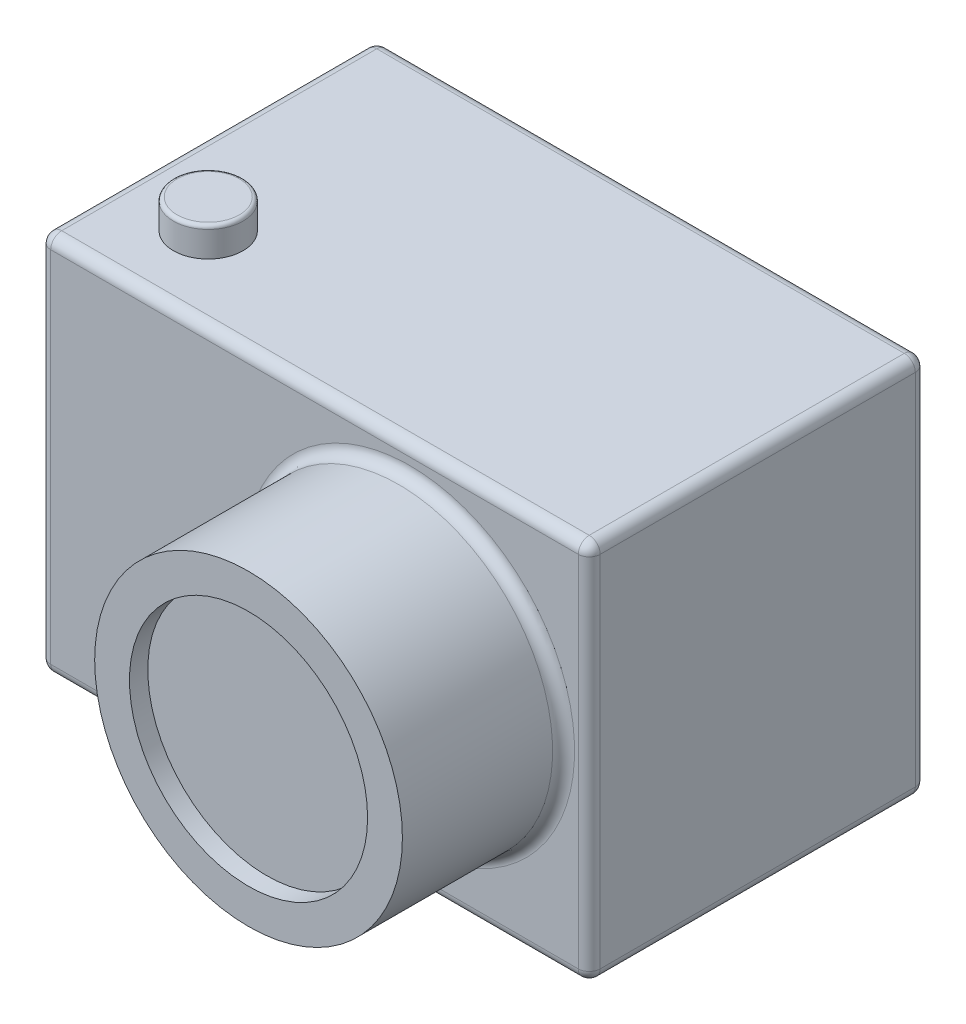
ISO-10303-21;
HEADER;
FILE_DESCRIPTION(('STEP AP214'),'2;1');
FILE_NAME('part.step','',(''),(''),'','','');
FILE_SCHEMA(('AUTOMOTIVE_DESIGN { 1 0 10303 214 1 1 1 1 }'));
ENDSEC;
DATA;
#1=APPLICATION_CONTEXT('core data for automotive mechanical design processes');
#2=APPLICATION_PROTOCOL_DEFINITION('international standard','automotive_design',2000,#1);
#3=PRODUCT_CONTEXT('',#1,'mechanical');
#4=PRODUCT('Part','Part','',(#3));
#5=PRODUCT_RELATED_PRODUCT_CATEGORY('part','',(#4));
#6=PRODUCT_DEFINITION_FORMATION('','',#4);
#7=PRODUCT_DEFINITION_CONTEXT('part definition',#1,'design');
#8=PRODUCT_DEFINITION('design','',#6,#7);
#9=PRODUCT_DEFINITION_SHAPE('','',#8);
#10=(LENGTH_UNIT() NAMED_UNIT(*) SI_UNIT(.MILLI.,.METRE.));
#11=(NAMED_UNIT(*) PLANE_ANGLE_UNIT() SI_UNIT($,.RADIAN.));
#12=(NAMED_UNIT(*) SI_UNIT($,.STERADIAN.) SOLID_ANGLE_UNIT());
#13=UNCERTAINTY_MEASURE_WITH_UNIT(LENGTH_MEASURE(1.E-05),#10,'distance_accuracy_value','');
#14=(GEOMETRIC_REPRESENTATION_CONTEXT(3) GLOBAL_UNCERTAINTY_ASSIGNED_CONTEXT((#13)) GLOBAL_UNIT_ASSIGNED_CONTEXT((#10,
#11,#12)) REPRESENTATION_CONTEXT('',''));
#15=CARTESIAN_POINT('',(0.,0.,0.));
#16=DIRECTION('',(0.,0.,1.));
#17=DIRECTION('',(1.,0.,0.));
#18=AXIS2_PLACEMENT_3D('',#15,#16,#17);
#19=CARTESIAN_POINT('',(0.,0.,-92.));
#20=DIRECTION('',(-1.,0.,0.));
#21=DIRECTION('',(0.,0.,1.));
#22=AXIS2_PLACEMENT_3D('',#19,#20,#21);
#23=PLANE('',#22);
#24=DIRECTION('',(0.,0.,1.));
#25=VECTOR('',#24,1.);
#26=CARTESIAN_POINT('',(0.,101.,-92.));
#27=LINE('',#26,#25);
#28=CARTESIAN_POINT('',(0.,101.,-3.));
#29=VERTEX_POINT('',#28);
#30=CARTESIAN_POINT('',(0.,101.,-89.));
#31=VERTEX_POINT('',#30);
#32=EDGE_CURVE('E303',#29,#31,#27,.F.);
#33=ORIENTED_EDGE('',*,*,#32,.T.);
#34=DIRECTION('',(0.,-1.,0.));
#35=VECTOR('',#34,1.);
#36=CARTESIAN_POINT('',(0.,0.,-89.));
#37=LINE('',#36,#35);
#38=CARTESIAN_POINT('',(0.,3.,-89.));
#39=VERTEX_POINT('',#38);
#40=EDGE_CURVE('E155',#31,#39,#37,.T.);
#41=ORIENTED_EDGE('',*,*,#40,.T.);
#42=DIRECTION('',(0.,0.,1.));
#43=VECTOR('',#42,1.);
#44=CARTESIAN_POINT('',(0.,3.,-92.));
#45=LINE('',#44,#43);
#46=CARTESIAN_POINT('',(0.,3.,-3.));
#47=VERTEX_POINT('',#46);
#48=EDGE_CURVE('E301',#39,#47,#45,.T.);
#49=ORIENTED_EDGE('',*,*,#48,.T.);
#50=DIRECTION('',(0.,-1.,0.));
#51=VECTOR('',#50,1.);
#52=CARTESIAN_POINT('',(0.,104.,-3.));
#53=LINE('',#52,#51);
#54=EDGE_CURVE('E299',#47,#29,#53,.F.);
#55=ORIENTED_EDGE('',*,*,#54,.T.);
#56=EDGE_LOOP('',(#33,#41,#49,#55));
#57=FACE_BOUND('',#56,.T.);
#58=ADVANCED_FACE('F132',(#57),#23,.T.);
#59=CARTESIAN_POINT('',(0.,104.,-92.));
#60=DIRECTION('',(0.,1.,0.));
#61=DIRECTION('',(0.,0.,1.));
#62=AXIS2_PLACEMENT_3D('',#59,#60,#61);
#63=PLANE('',#62);
#64=CARTESIAN_POINT('',(23.,104.,-23.));
#65=DIRECTION('',(0.,1.,0.));
#66=DIRECTION('',(0.,0.,1.));
#67=AXIS2_PLACEMENT_3D('',#64,#65,#66);
#68=CIRCLE('',#67,9.5);
#69=CARTESIAN_POINT('',(23.,104.,-13.5));
#70=VERTEX_POINT('',#69);
#71=EDGE_CURVE('E235',#70,#70,#68,.T.);
#72=ORIENTED_EDGE('',*,*,#71,.F.);
#73=EDGE_LOOP('',(#72));
#74=FACE_BOUND('',#73,.T.);
#75=DIRECTION('',(-1.,0.,0.));
#76=VECTOR('',#75,1.);
#77=CARTESIAN_POINT('',(0.,104.,-89.));
#78=LINE('',#77,#76);
#79=CARTESIAN_POINT('',(147.,104.,-89.));
#80=VERTEX_POINT('',#79);
#81=CARTESIAN_POINT('',(3.,104.,-89.));
#82=VERTEX_POINT('',#81);
#83=EDGE_CURVE('E294',#80,#82,#78,.T.);
#84=ORIENTED_EDGE('',*,*,#83,.T.);
#85=DIRECTION('',(0.,0.,1.));
#86=VECTOR('',#85,1.);
#87=CARTESIAN_POINT('',(3.,104.,-92.));
#88=LINE('',#87,#86);
#89=CARTESIAN_POINT('',(3.,104.,-3.));
#90=VERTEX_POINT('',#89);
#91=EDGE_CURVE('E296',#82,#90,#88,.T.);
#92=ORIENTED_EDGE('',*,*,#91,.T.);
#93=DIRECTION('',(-1.,0.,0.));
#94=VECTOR('',#93,1.);
#95=CARTESIAN_POINT('',(150.,104.,-3.));
#96=LINE('',#95,#94);
#97=CARTESIAN_POINT('',(147.,104.,-3.));
#98=VERTEX_POINT('',#97);
#99=EDGE_CURVE('E290',#90,#98,#96,.F.);
#100=ORIENTED_EDGE('',*,*,#99,.T.);
#101=DIRECTION('',(0.,0.,1.));
#102=VECTOR('',#101,1.);
#103=CARTESIAN_POINT('',(147.,104.,-92.));
#104=LINE('',#103,#102);
#105=EDGE_CURVE('E292',#98,#80,#104,.F.);
#106=ORIENTED_EDGE('',*,*,#105,.T.);
#107=EDGE_LOOP('',(#84,#92,#100,#106));
#108=FACE_BOUND('',#107,.T.);
#109=ADVANCED_FACE('F384',(#74,#108),#63,.T.);
#110=CARTESIAN_POINT('',(150.,0.,-92.));
#111=DIRECTION('',(1.,0.,0.));
#112=DIRECTION('',(0.,0.,-1.));
#113=AXIS2_PLACEMENT_3D('',#110,#111,#112);
#114=PLANE('',#113);
#115=DIRECTION('',(0.,0.,1.));
#116=VECTOR('',#115,1.);
#117=CARTESIAN_POINT('',(150.,3.,-92.));
#118=LINE('',#117,#116);
#119=CARTESIAN_POINT('',(150.,3.,-3.));
#120=VERTEX_POINT('',#119);
#121=CARTESIAN_POINT('',(150.,3.,-89.));
#122=VERTEX_POINT('',#121);
#123=EDGE_CURVE('E259',#120,#122,#118,.F.);
#124=ORIENTED_EDGE('',*,*,#123,.T.);
#125=DIRECTION('',(0.,1.,0.));
#126=VECTOR('',#125,1.);
#127=CARTESIAN_POINT('',(150.,0.,-89.));
#128=LINE('',#127,#126);
#129=CARTESIAN_POINT('',(150.,101.,-89.));
#130=VERTEX_POINT('',#129);
#131=EDGE_CURVE('E229',#122,#130,#128,.T.);
#132=ORIENTED_EDGE('',*,*,#131,.T.);
#133=DIRECTION('',(0.,0.,1.));
#134=VECTOR('',#133,1.);
#135=CARTESIAN_POINT('',(150.,101.,-92.));
#136=LINE('',#135,#134);
#137=CARTESIAN_POINT('',(150.,101.,-3.));
#138=VERTEX_POINT('',#137);
#139=EDGE_CURVE('E248',#130,#138,#136,.T.);
#140=ORIENTED_EDGE('',*,*,#139,.T.);
#141=DIRECTION('',(0.,1.,0.));
#142=VECTOR('',#141,1.);
#143=CARTESIAN_POINT('',(150.,0.,-3.));
#144=LINE('',#143,#142);
#145=EDGE_CURVE('E254',#138,#120,#144,.F.);
#146=ORIENTED_EDGE('',*,*,#145,.T.);
#147=EDGE_LOOP('',(#124,#132,#140,#146));
#148=FACE_BOUND('',#147,.T.);
#149=ADVANCED_FACE('F257',(#148),#114,.T.);
#150=CARTESIAN_POINT('',(0.,0.,-92.));
#151=DIRECTION('',(0.,-1.,0.));
#152=DIRECTION('',(0.,0.,-1.));
#153=AXIS2_PLACEMENT_3D('',#150,#151,#152);
#154=PLANE('',#153);
#155=DIRECTION('',(0.,0.,1.));
#156=VECTOR('',#155,1.);
#157=CARTESIAN_POINT('',(3.,0.,-92.));
#158=LINE('',#157,#156);
#159=CARTESIAN_POINT('',(3.,0.,-3.));
#160=VERTEX_POINT('',#159);
#161=CARTESIAN_POINT('',(3.,0.,-89.));
#162=VERTEX_POINT('',#161);
#163=EDGE_CURVE('E274',#160,#162,#158,.F.);
#164=ORIENTED_EDGE('',*,*,#163,.T.);
#165=DIRECTION('',(1.,0.,0.));
#166=VECTOR('',#165,1.);
#167=CARTESIAN_POINT('',(0.,0.,-89.));
#168=LINE('',#167,#166);
#169=CARTESIAN_POINT('',(147.,0.,-89.));
#170=VERTEX_POINT('',#169);
#171=EDGE_CURVE('E279',#162,#170,#168,.T.);
#172=ORIENTED_EDGE('',*,*,#171,.T.);
#173=DIRECTION('',(0.,0.,1.));
#174=VECTOR('',#173,1.);
#175=CARTESIAN_POINT('',(147.,0.,-92.));
#176=LINE('',#175,#174);
#177=CARTESIAN_POINT('',(147.,0.,-3.));
#178=VERTEX_POINT('',#177);
#179=EDGE_CURVE('E276',#170,#178,#176,.T.);
#180=ORIENTED_EDGE('',*,*,#179,.T.);
#181=DIRECTION('',(1.,0.,0.));
#182=VECTOR('',#181,1.);
#183=CARTESIAN_POINT('',(0.,0.,-3.));
#184=LINE('',#183,#182);
#185=EDGE_CURVE('E272',#178,#160,#184,.F.);
#186=ORIENTED_EDGE('',*,*,#185,.T.);
#187=EDGE_LOOP('',(#164,#172,#180,#186));
#188=FACE_BOUND('',#187,.T.);
#189=ADVANCED_FACE('F393',(#188),#154,.T.);
#190=CARTESIAN_POINT('',(0.,0.,-92.));
#191=DIRECTION('',(0.,0.,-1.));
#192=DIRECTION('',(-1.,0.,0.));
#193=AXIS2_PLACEMENT_3D('',#190,#191,#192);
#194=PLANE('',#193);
#195=DIRECTION('',(-1.,0.,0.));
#196=VECTOR('',#195,1.);
#197=CARTESIAN_POINT('',(0.,101.,-92.));
#198=LINE('',#197,#196);
#199=CARTESIAN_POINT('',(3.,101.,-92.));
#200=VERTEX_POINT('',#199);
#201=CARTESIAN_POINT('',(147.,101.,-92.));
#202=VERTEX_POINT('',#201);
#203=EDGE_CURVE('E269',#200,#202,#198,.F.);
#204=ORIENTED_EDGE('',*,*,#203,.T.);
#205=DIRECTION('',(0.,1.,0.));
#206=VECTOR('',#205,1.);
#207=CARTESIAN_POINT('',(147.,0.,-92.));
#208=LINE('',#207,#206);
#209=CARTESIAN_POINT('',(147.,3.,-92.));
#210=VERTEX_POINT('',#209);
#211=EDGE_CURVE('E231',#202,#210,#208,.F.);
#212=ORIENTED_EDGE('',*,*,#211,.T.);
#213=DIRECTION('',(1.,0.,0.));
#214=VECTOR('',#213,1.);
#215=CARTESIAN_POINT('',(0.,3.,-92.));
#216=LINE('',#215,#214);
#217=CARTESIAN_POINT('',(3.,3.,-92.));
#218=VERTEX_POINT('',#217);
#219=EDGE_CURVE('E263',#210,#218,#216,.F.);
#220=ORIENTED_EDGE('',*,*,#219,.T.);
#221=DIRECTION('',(0.,-1.,0.));
#222=VECTOR('',#221,1.);
#223=CARTESIAN_POINT('',(3.,0.,-92.));
#224=LINE('',#223,#222);
#225=EDGE_CURVE('E261',#218,#200,#224,.F.);
#226=ORIENTED_EDGE('',*,*,#225,.T.);
#227=EDGE_LOOP('',(#204,#212,#220,#226));
#228=FACE_BOUND('',#227,.T.);
#229=ADVANCED_FACE('F505',(#228),#194,.T.);
#230=CARTESIAN_POINT('',(0.,0.,0.));
#231=DIRECTION('',(0.,0.,-1.));
#232=DIRECTION('',(-1.,0.,0.));
#233=AXIS2_PLACEMENT_3D('',#230,#231,#232);
#234=PLANE('',#233);
#235=CARTESIAN_POINT('',(101.,54.,0.));
#236=DIRECTION('',(0.,0.,-1.));
#237=DIRECTION('',(-1.,0.,0.));
#238=AXIS2_PLACEMENT_3D('',#235,#236,#237);
#239=CIRCLE('',#238,45.);
#240=CARTESIAN_POINT('',(56.,54.,0.));
#241=VERTEX_POINT('',#240);
#242=EDGE_CURVE('E363',#241,#241,#239,.T.);
#243=ORIENTED_EDGE('',*,*,#242,.T.);
#244=EDGE_LOOP('',(#243));
#245=FACE_BOUND('',#244,.T.);
#246=DIRECTION('',(1.,0.,0.));
#247=VECTOR('',#246,1.);
#248=CARTESIAN_POINT('',(150.,3.,0.));
#249=LINE('',#248,#247);
#250=CARTESIAN_POINT('',(3.,3.,0.));
#251=VERTEX_POINT('',#250);
#252=CARTESIAN_POINT('',(147.,3.,0.));
#253=VERTEX_POINT('',#252);
#254=EDGE_CURVE('E283',#251,#253,#249,.T.);
#255=ORIENTED_EDGE('',*,*,#254,.T.);
#256=DIRECTION('',(0.,1.,0.));
#257=VECTOR('',#256,1.);
#258=CARTESIAN_POINT('',(147.,104.,0.));
#259=LINE('',#258,#257);
#260=CARTESIAN_POINT('',(147.,101.,0.));
#261=VERTEX_POINT('',#260);
#262=EDGE_CURVE('E287',#253,#261,#259,.T.);
#263=ORIENTED_EDGE('',*,*,#262,.T.);
#264=DIRECTION('',(-1.,0.,0.));
#265=VECTOR('',#264,1.);
#266=CARTESIAN_POINT('',(0.,101.,0.));
#267=LINE('',#266,#265);
#268=CARTESIAN_POINT('',(3.,101.,0.));
#269=VERTEX_POINT('',#268);
#270=EDGE_CURVE('E285',#261,#269,#267,.T.);
#271=ORIENTED_EDGE('',*,*,#270,.T.);
#272=DIRECTION('',(0.,-1.,0.));
#273=VECTOR('',#272,1.);
#274=CARTESIAN_POINT('',(3.,0.,0.));
#275=LINE('',#274,#273);
#276=EDGE_CURVE('E281',#269,#251,#275,.T.);
#277=ORIENTED_EDGE('',*,*,#276,.T.);
#278=EDGE_LOOP('',(#255,#263,#271,#277));
#279=FACE_BOUND('',#278,.T.);
#280=ADVANCED_FACE('F483',(#245,#279),#234,.F.);
#281=CARTESIAN_POINT('',(101.,54.,44.));
#282=DIRECTION('',(0.,0.,-1.));
#283=DIRECTION('',(-1.,0.,0.));
#284=AXIS2_PLACEMENT_3D('',#281,#282,#283);
#285=CYLINDRICAL_SURFACE('',#284,42.);
#286=CARTESIAN_POINT('',(101.,54.,3.));
#287=DIRECTION('',(0.,0.,-1.));
#288=DIRECTION('',(-1.,0.,0.));
#289=AXIS2_PLACEMENT_3D('',#286,#287,#288);
#290=CIRCLE('',#289,42.);
#291=CARTESIAN_POINT('',(59.,54.,3.));
#292=VERTEX_POINT('',#291);
#293=EDGE_CURVE('E305',#292,#292,#290,.F.);
#294=ORIENTED_EDGE('',*,*,#293,.T.);
#295=EDGE_LOOP('',(#294));
#296=FACE_BOUND('',#295,.T.);
#297=CARTESIAN_POINT('',(101.,54.,44.));
#298=DIRECTION('',(0.,0.,1.));
#299=DIRECTION('',(1.,0.,0.));
#300=AXIS2_PLACEMENT_3D('',#297,#298,#299);
#301=CIRCLE('',#300,42.);
#302=CARTESIAN_POINT('',(143.,54.,44.));
#303=VERTEX_POINT('',#302);
#304=EDGE_CURVE('E255',#303,#303,#301,.T.);
#305=ORIENTED_EDGE('',*,*,#304,.F.);
#306=EDGE_LOOP('',(#305));
#307=FACE_BOUND('',#306,.T.);
#308=ADVANCED_FACE('F480',(#296,#307),#285,.T.);
#309=CARTESIAN_POINT('',(101.,54.,44.));
#310=DIRECTION('',(0.,0.,1.));
#311=DIRECTION('',(1.,0.,0.));
#312=AXIS2_PLACEMENT_3D('',#309,#310,#311);
#313=PLANE('',#312);
#314=CARTESIAN_POINT('',(101.,54.,44.));
#315=DIRECTION('',(0.,0.,1.));
#316=DIRECTION('',(1.,0.,0.));
#317=AXIS2_PLACEMENT_3D('',#314,#315,#316);
#318=CIRCLE('',#317,32.5);
#319=CARTESIAN_POINT('',(133.5,54.,44.));
#320=VERTEX_POINT('',#319);
#321=EDGE_CURVE('E549',#320,#320,#318,.T.);
#322=ORIENTED_EDGE('',*,*,#321,.F.);
#323=EDGE_LOOP('',(#322));
#324=FACE_BOUND('',#323,.T.);
#325=ORIENTED_EDGE('',*,*,#304,.T.);
#326=EDGE_LOOP('',(#325));
#327=FACE_BOUND('',#326,.T.);
#328=ADVANCED_FACE('F467',(#324,#327),#313,.T.);
#329=CARTESIAN_POINT('',(3.,0.,-3.));
#330=DIRECTION('',(0.,1.,0.));
#331=DIRECTION('',(0.,0.,1.));
#332=AXIS2_PLACEMENT_3D('',#329,#330,#331);
#333=CYLINDRICAL_SURFACE('',#332,3.);
#334=CARTESIAN_POINT('',(3.,3.,-3.));
#335=DIRECTION('',(0.,-1.,0.));
#336=DIRECTION('',(0.,0.,-1.));
#337=AXIS2_PLACEMENT_3D('',#334,#335,#336);
#338=CIRCLE('',#337,3.);
#339=EDGE_CURVE('E358',#251,#47,#338,.T.);
#340=ORIENTED_EDGE('',*,*,#339,.F.);
#341=ORIENTED_EDGE('',*,*,#276,.F.);
#342=CARTESIAN_POINT('',(3.,101.,-3.));
#343=DIRECTION('',(0.,1.,0.));
#344=DIRECTION('',(0.,0.,1.));
#345=AXIS2_PLACEMENT_3D('',#342,#343,#344);
#346=CIRCLE('',#345,3.);
#347=EDGE_CURVE('E355',#29,#269,#346,.T.);
#348=ORIENTED_EDGE('',*,*,#347,.F.);
#349=ORIENTED_EDGE('',*,*,#54,.F.);
#350=EDGE_LOOP('',(#340,#341,#348,#349));
#351=FACE_BOUND('',#350,.T.);
#352=ADVANCED_FACE('F464',(#351),#333,.T.);
#353=CARTESIAN_POINT('',(3.,3.,-3.));
#354=DIRECTION('',(-1.,0.,0.));
#355=DIRECTION('',(0.,0.,1.));
#356=AXIS2_PLACEMENT_3D('',#353,#354,#355);
#357=SPHERICAL_SURFACE('',#356,3.);
#358=CARTESIAN_POINT('',(3.,3.,-3.));
#359=DIRECTION('',(-1.,0.,0.));
#360=DIRECTION('',(0.,0.,1.));
#361=AXIS2_PLACEMENT_3D('',#358,#359,#360);
#362=CIRCLE('',#361,3.);
#363=EDGE_CURVE('E349',#251,#160,#362,.F.);
#364=ORIENTED_EDGE('',*,*,#363,.F.);
#365=ORIENTED_EDGE('',*,*,#339,.T.);
#366=CARTESIAN_POINT('',(3.,3.,-3.));
#367=DIRECTION('',(0.,0.,1.));
#368=DIRECTION('',(1.,0.,0.));
#369=AXIS2_PLACEMENT_3D('',#366,#367,#368);
#370=CIRCLE('',#369,3.);
#371=EDGE_CURVE('E352',#160,#47,#370,.F.);
#372=ORIENTED_EDGE('',*,*,#371,.F.);
#373=EDGE_LOOP('',(#364,#365,#372));
#374=FACE_BOUND('',#373,.T.);
#375=ADVANCED_FACE('F460',(#374),#357,.T.);
#376=CARTESIAN_POINT('',(3.,101.,-3.));
#377=DIRECTION('',(0.,0.,1.));
#378=DIRECTION('',(1.,0.,0.));
#379=AXIS2_PLACEMENT_3D('',#376,#377,#378);
#380=SPHERICAL_SURFACE('',#379,3.);
#381=CARTESIAN_POINT('',(3.,101.,-3.));
#382=DIRECTION('',(0.,0.,1.));
#383=DIRECTION('',(1.,0.,0.));
#384=AXIS2_PLACEMENT_3D('',#381,#382,#383);
#385=CIRCLE('',#384,3.);
#386=EDGE_CURVE('E343',#29,#90,#385,.F.);
#387=ORIENTED_EDGE('',*,*,#386,.F.);
#388=ORIENTED_EDGE('',*,*,#347,.T.);
#389=CARTESIAN_POINT('',(3.,101.,-3.));
#390=DIRECTION('',(-1.,0.,0.));
#391=DIRECTION('',(0.,0.,1.));
#392=AXIS2_PLACEMENT_3D('',#389,#390,#391);
#393=CIRCLE('',#392,3.);
#394=EDGE_CURVE('E346',#90,#269,#393,.F.);
#395=ORIENTED_EDGE('',*,*,#394,.F.);
#396=EDGE_LOOP('',(#387,#388,#395));
#397=FACE_BOUND('',#396,.T.);
#398=ADVANCED_FACE('F456',(#397),#380,.T.);
#399=CARTESIAN_POINT('',(3.,3.,-92.));
#400=DIRECTION('',(0.,0.,1.));
#401=DIRECTION('',(1.,0.,0.));
#402=AXIS2_PLACEMENT_3D('',#399,#400,#401);
#403=CYLINDRICAL_SURFACE('',#402,3.);
#404=ORIENTED_EDGE('',*,*,#371,.T.);
#405=ORIENTED_EDGE('',*,*,#48,.F.);
#406=CARTESIAN_POINT('',(3.,3.,-89.));
#407=DIRECTION('',(0.,0.,-1.));
#408=DIRECTION('',(-1.,0.,0.));
#409=AXIS2_PLACEMENT_3D('',#406,#407,#408);
#410=CIRCLE('',#409,3.);
#411=EDGE_CURVE('E337',#162,#39,#410,.T.);
#412=ORIENTED_EDGE('',*,*,#411,.F.);
#413=ORIENTED_EDGE('',*,*,#163,.F.);
#414=EDGE_LOOP('',(#404,#405,#412,#413));
#415=FACE_BOUND('',#414,.T.);
#416=ADVANCED_FACE('F452',(#415),#403,.T.);
#417=CARTESIAN_POINT('',(0.,3.,-3.));
#418=DIRECTION('',(-1.,0.,0.));
#419=DIRECTION('',(0.,0.,1.));
#420=AXIS2_PLACEMENT_3D('',#417,#418,#419);
#421=CYLINDRICAL_SURFACE('',#420,3.);
#422=ORIENTED_EDGE('',*,*,#363,.T.);
#423=ORIENTED_EDGE('',*,*,#185,.F.);
#424=CARTESIAN_POINT('',(147.,3.,-3.));
#425=DIRECTION('',(1.,0.,0.));
#426=DIRECTION('',(0.,0.,-1.));
#427=AXIS2_PLACEMENT_3D('',#424,#425,#426);
#428=CIRCLE('',#427,3.);
#429=EDGE_CURVE('E334',#253,#178,#428,.T.);
#430=ORIENTED_EDGE('',*,*,#429,.F.);
#431=ORIENTED_EDGE('',*,*,#254,.F.);
#432=EDGE_LOOP('',(#422,#423,#430,#431));
#433=FACE_BOUND('',#432,.T.);
#434=ADVANCED_FACE('F448',(#433),#421,.T.);
#435=CARTESIAN_POINT('',(147.,0.,-3.));
#436=DIRECTION('',(0.,-1.,0.));
#437=DIRECTION('',(0.,0.,-1.));
#438=AXIS2_PLACEMENT_3D('',#435,#436,#437);
#439=CYLINDRICAL_SURFACE('',#438,3.);
#440=CARTESIAN_POINT('',(147.,101.,-3.));
#441=DIRECTION('',(0.,1.,0.));
#442=DIRECTION('',(0.,0.,1.));
#443=AXIS2_PLACEMENT_3D('',#440,#441,#442);
#444=CIRCLE('',#443,3.);
#445=EDGE_CURVE('E328',#261,#138,#444,.T.);
#446=ORIENTED_EDGE('',*,*,#445,.F.);
#447=ORIENTED_EDGE('',*,*,#262,.F.);
#448=CARTESIAN_POINT('',(147.,3.,-3.));
#449=DIRECTION('',(0.,-1.,0.));
#450=DIRECTION('',(0.,0.,-1.));
#451=AXIS2_PLACEMENT_3D('',#448,#449,#450);
#452=CIRCLE('',#451,3.);
#453=EDGE_CURVE('E331',#120,#253,#452,.T.);
#454=ORIENTED_EDGE('',*,*,#453,.F.);
#455=ORIENTED_EDGE('',*,*,#145,.F.);
#456=EDGE_LOOP('',(#446,#447,#454,#455));
#457=FACE_BOUND('',#456,.T.);
#458=ADVANCED_FACE('F444',(#457),#439,.T.);
#459=CARTESIAN_POINT('',(0.,101.,-3.));
#460=DIRECTION('',(1.,0.,0.));
#461=DIRECTION('',(0.,0.,-1.));
#462=AXIS2_PLACEMENT_3D('',#459,#460,#461);
#463=CYLINDRICAL_SURFACE('',#462,3.);
#464=ORIENTED_EDGE('',*,*,#394,.T.);
#465=ORIENTED_EDGE('',*,*,#270,.F.);
#466=CARTESIAN_POINT('',(147.,101.,-3.));
#467=DIRECTION('',(1.,0.,0.));
#468=DIRECTION('',(0.,0.,-1.));
#469=AXIS2_PLACEMENT_3D('',#466,#467,#468);
#470=CIRCLE('',#469,3.);
#471=EDGE_CURVE('E326',#98,#261,#470,.T.);
#472=ORIENTED_EDGE('',*,*,#471,.F.);
#473=ORIENTED_EDGE('',*,*,#99,.F.);
#474=EDGE_LOOP('',(#464,#465,#472,#473));
#475=FACE_BOUND('',#474,.T.);
#476=ADVANCED_FACE('F440',(#475),#463,.T.);
#477=CARTESIAN_POINT('',(3.,101.,-92.));
#478=DIRECTION('',(0.,0.,1.));
#479=DIRECTION('',(1.,0.,0.));
#480=AXIS2_PLACEMENT_3D('',#477,#478,#479);
#481=CYLINDRICAL_SURFACE('',#480,3.);
#482=ORIENTED_EDGE('',*,*,#386,.T.);
#483=ORIENTED_EDGE('',*,*,#91,.F.);
#484=CARTESIAN_POINT('',(3.,101.,-89.));
#485=DIRECTION('',(0.,0.,-1.));
#486=DIRECTION('',(-1.,0.,0.));
#487=AXIS2_PLACEMENT_3D('',#484,#485,#486);
#488=CIRCLE('',#487,3.);
#489=EDGE_CURVE('E324',#31,#82,#488,.T.);
#490=ORIENTED_EDGE('',*,*,#489,.F.);
#491=ORIENTED_EDGE('',*,*,#32,.F.);
#492=EDGE_LOOP('',(#482,#483,#490,#491));
#493=FACE_BOUND('',#492,.T.);
#494=ADVANCED_FACE('F436',(#493),#481,.T.);
#495=CARTESIAN_POINT('',(3.,0.,-89.));
#496=DIRECTION('',(0.,-1.,0.));
#497=DIRECTION('',(0.,0.,-1.));
#498=AXIS2_PLACEMENT_3D('',#495,#496,#497);
#499=CYLINDRICAL_SURFACE('',#498,3.);
#500=CARTESIAN_POINT('',(3.,3.,-89.));
#501=DIRECTION('',(0.,-1.,0.));
#502=DIRECTION('',(0.,0.,-1.));
#503=AXIS2_PLACEMENT_3D('',#500,#501,#502);
#504=CIRCLE('',#503,3.);
#505=EDGE_CURVE('E340',#39,#218,#504,.T.);
#506=ORIENTED_EDGE('',*,*,#505,.F.);
#507=ORIENTED_EDGE('',*,*,#40,.F.);
#508=CARTESIAN_POINT('',(3.,101.,-89.));
#509=DIRECTION('',(0.,1.,0.));
#510=DIRECTION('',(0.,0.,1.));
#511=AXIS2_PLACEMENT_3D('',#508,#509,#510);
#512=CIRCLE('',#511,3.);
#513=EDGE_CURVE('E147',#200,#31,#512,.T.);
#514=ORIENTED_EDGE('',*,*,#513,.F.);
#515=ORIENTED_EDGE('',*,*,#225,.F.);
#516=EDGE_LOOP('',(#506,#507,#514,#515));
#517=FACE_BOUND('',#516,.T.);
#518=ADVANCED_FACE('F432',(#517),#499,.T.);
#519=CARTESIAN_POINT('',(3.,3.,-89.));
#520=DIRECTION('',(-1.,0.,0.));
#521=DIRECTION('',(0.,0.,1.));
#522=AXIS2_PLACEMENT_3D('',#519,#520,#521);
#523=SPHERICAL_SURFACE('',#522,3.);
#524=ORIENTED_EDGE('',*,*,#411,.T.);
#525=ORIENTED_EDGE('',*,*,#505,.T.);
#526=CARTESIAN_POINT('',(3.,3.,-89.));
#527=DIRECTION('',(-1.,0.,0.));
#528=DIRECTION('',(0.,0.,1.));
#529=AXIS2_PLACEMENT_3D('',#526,#527,#528);
#530=CIRCLE('',#529,3.);
#531=EDGE_CURVE('E320',#162,#218,#530,.F.);
#532=ORIENTED_EDGE('',*,*,#531,.F.);
#533=EDGE_LOOP('',(#524,#525,#532));
#534=FACE_BOUND('',#533,.T.);
#535=ADVANCED_FACE('F428',(#534),#523,.T.);
#536=CARTESIAN_POINT('',(147.,3.,-3.));
#537=DIRECTION('',(0.,0.,1.));
#538=DIRECTION('',(1.,0.,0.));
#539=AXIS2_PLACEMENT_3D('',#536,#537,#538);
#540=SPHERICAL_SURFACE('',#539,3.);
#541=ORIENTED_EDGE('',*,*,#453,.T.);
#542=ORIENTED_EDGE('',*,*,#429,.T.);
#543=CARTESIAN_POINT('',(147.,3.,-3.));
#544=DIRECTION('',(0.,0.,1.));
#545=DIRECTION('',(1.,0.,0.));
#546=AXIS2_PLACEMENT_3D('',#543,#544,#545);
#547=CIRCLE('',#546,3.);
#548=EDGE_CURVE('E318',#120,#178,#547,.F.);
#549=ORIENTED_EDGE('',*,*,#548,.F.);
#550=EDGE_LOOP('',(#541,#542,#549));
#551=FACE_BOUND('',#550,.T.);
#552=ADVANCED_FACE('F424',(#551),#540,.T.);
#553=CARTESIAN_POINT('',(147.,101.,-3.));
#554=DIRECTION('',(0.,0.,1.));
#555=DIRECTION('',(1.,0.,0.));
#556=AXIS2_PLACEMENT_3D('',#553,#554,#555);
#557=SPHERICAL_SURFACE('',#556,3.);
#558=ORIENTED_EDGE('',*,*,#471,.T.);
#559=ORIENTED_EDGE('',*,*,#445,.T.);
#560=CARTESIAN_POINT('',(147.,101.,-3.));
#561=DIRECTION('',(0.,0.,1.));
#562=DIRECTION('',(1.,0.,0.));
#563=AXIS2_PLACEMENT_3D('',#560,#561,#562);
#564=CIRCLE('',#563,3.);
#565=EDGE_CURVE('E251',#98,#138,#564,.F.);
#566=ORIENTED_EDGE('',*,*,#565,.F.);
#567=EDGE_LOOP('',(#558,#559,#566));
#568=FACE_BOUND('',#567,.T.);
#569=ADVANCED_FACE('F421',(#568),#557,.T.);
#570=CARTESIAN_POINT('',(3.,101.,-89.));
#571=DIRECTION('',(-1.,0.,0.));
#572=DIRECTION('',(0.,0.,1.));
#573=AXIS2_PLACEMENT_3D('',#570,#571,#572);
#574=SPHERICAL_SURFACE('',#573,3.);
#575=ORIENTED_EDGE('',*,*,#513,.T.);
#576=ORIENTED_EDGE('',*,*,#489,.T.);
#577=CARTESIAN_POINT('',(3.,101.,-89.));
#578=DIRECTION('',(-1.,0.,0.));
#579=DIRECTION('',(0.,0.,1.));
#580=AXIS2_PLACEMENT_3D('',#577,#578,#579);
#581=CIRCLE('',#580,3.);
#582=EDGE_CURVE('E314',#200,#82,#581,.F.);
#583=ORIENTED_EDGE('',*,*,#582,.F.);
#584=EDGE_LOOP('',(#575,#576,#583));
#585=FACE_BOUND('',#584,.T.);
#586=ADVANCED_FACE('F417',(#585),#574,.T.);
#587=CARTESIAN_POINT('',(0.,3.,-89.));
#588=DIRECTION('',(1.,0.,0.));
#589=DIRECTION('',(0.,0.,-1.));
#590=AXIS2_PLACEMENT_3D('',#587,#588,#589);
#591=CYLINDRICAL_SURFACE('',#590,3.);
#592=ORIENTED_EDGE('',*,*,#531,.T.);
#593=ORIENTED_EDGE('',*,*,#219,.F.);
#594=CARTESIAN_POINT('',(147.,3.,-89.));
#595=DIRECTION('',(1.,0.,0.));
#596=DIRECTION('',(0.,0.,-1.));
#597=AXIS2_PLACEMENT_3D('',#594,#595,#596);
#598=CIRCLE('',#597,3.);
#599=EDGE_CURVE('E311',#170,#210,#598,.T.);
#600=ORIENTED_EDGE('',*,*,#599,.F.);
#601=ORIENTED_EDGE('',*,*,#171,.F.);
#602=EDGE_LOOP('',(#592,#593,#600,#601));
#603=FACE_BOUND('',#602,.T.);
#604=ADVANCED_FACE('F413',(#603),#591,.T.);
#605=CARTESIAN_POINT('',(147.,3.,-92.));
#606=DIRECTION('',(0.,0.,1.));
#607=DIRECTION('',(1.,0.,0.));
#608=AXIS2_PLACEMENT_3D('',#605,#606,#607);
#609=CYLINDRICAL_SURFACE('',#608,3.);
#610=ORIENTED_EDGE('',*,*,#548,.T.);
#611=ORIENTED_EDGE('',*,*,#179,.F.);
#612=CARTESIAN_POINT('',(147.,3.,-89.));
#613=DIRECTION('',(0.,0.,-1.));
#614=DIRECTION('',(-1.,0.,0.));
#615=AXIS2_PLACEMENT_3D('',#612,#613,#614);
#616=CIRCLE('',#615,3.);
#617=EDGE_CURVE('E245',#122,#170,#616,.T.);
#618=ORIENTED_EDGE('',*,*,#617,.F.);
#619=ORIENTED_EDGE('',*,*,#123,.F.);
#620=EDGE_LOOP('',(#610,#611,#618,#619));
#621=FACE_BOUND('',#620,.T.);
#622=ADVANCED_FACE('F410',(#621),#609,.T.);
#623=CARTESIAN_POINT('',(147.,101.,-92.));
#624=DIRECTION('',(0.,0.,1.));
#625=DIRECTION('',(1.,0.,0.));
#626=AXIS2_PLACEMENT_3D('',#623,#624,#625);
#627=CYLINDRICAL_SURFACE('',#626,3.);
#628=ORIENTED_EDGE('',*,*,#565,.T.);
#629=ORIENTED_EDGE('',*,*,#139,.F.);
#630=CARTESIAN_POINT('',(147.,101.,-89.));
#631=DIRECTION('',(0.,0.,-1.));
#632=DIRECTION('',(-1.,0.,0.));
#633=AXIS2_PLACEMENT_3D('',#630,#631,#632);
#634=CIRCLE('',#633,3.);
#635=EDGE_CURVE('E238',#80,#130,#634,.T.);
#636=ORIENTED_EDGE('',*,*,#635,.F.);
#637=ORIENTED_EDGE('',*,*,#105,.F.);
#638=EDGE_LOOP('',(#628,#629,#636,#637));
#639=FACE_BOUND('',#638,.T.);
#640=ADVANCED_FACE('F249',(#639),#627,.T.);
#641=CARTESIAN_POINT('',(0.,101.,-89.));
#642=DIRECTION('',(-1.,0.,0.));
#643=DIRECTION('',(0.,0.,1.));
#644=AXIS2_PLACEMENT_3D('',#641,#642,#643);
#645=CYLINDRICAL_SURFACE('',#644,3.);
#646=ORIENTED_EDGE('',*,*,#582,.T.);
#647=ORIENTED_EDGE('',*,*,#83,.F.);
#648=CARTESIAN_POINT('',(147.,101.,-89.));
#649=DIRECTION('',(1.,0.,0.));
#650=DIRECTION('',(0.,0.,-1.));
#651=AXIS2_PLACEMENT_3D('',#648,#649,#650);
#652=CIRCLE('',#651,3.);
#653=EDGE_CURVE('E242',#202,#80,#652,.T.);
#654=ORIENTED_EDGE('',*,*,#653,.F.);
#655=ORIENTED_EDGE('',*,*,#203,.F.);
#656=EDGE_LOOP('',(#646,#647,#654,#655));
#657=FACE_BOUND('',#656,.T.);
#658=ADVANCED_FACE('F403',(#657),#645,.T.);
#659=CARTESIAN_POINT('',(147.,3.,-89.));
#660=DIRECTION('',(0.,-1.,0.));
#661=DIRECTION('',(0.,0.,-1.));
#662=AXIS2_PLACEMENT_3D('',#659,#660,#661);
#663=SPHERICAL_SURFACE('',#662,3.);
#664=ORIENTED_EDGE('',*,*,#617,.T.);
#665=ORIENTED_EDGE('',*,*,#599,.T.);
#666=CARTESIAN_POINT('',(147.,3.,-89.));
#667=DIRECTION('',(0.,-1.,0.));
#668=DIRECTION('',(0.,0.,-1.));
#669=AXIS2_PLACEMENT_3D('',#666,#667,#668);
#670=CIRCLE('',#669,3.);
#671=EDGE_CURVE('E234',#122,#210,#670,.F.);
#672=ORIENTED_EDGE('',*,*,#671,.F.);
#673=EDGE_LOOP('',(#664,#665,#672));
#674=FACE_BOUND('',#673,.T.);
#675=ADVANCED_FACE('F400',(#674),#663,.T.);
#676=CARTESIAN_POINT('',(147.,101.,-89.));
#677=DIRECTION('',(0.,1.,0.));
#678=DIRECTION('',(0.,0.,1.));
#679=AXIS2_PLACEMENT_3D('',#676,#677,#678);
#680=SPHERICAL_SURFACE('',#679,3.);
#681=ORIENTED_EDGE('',*,*,#653,.T.);
#682=ORIENTED_EDGE('',*,*,#635,.T.);
#683=CARTESIAN_POINT('',(147.,101.,-89.));
#684=DIRECTION('',(0.,1.,0.));
#685=DIRECTION('',(0.,0.,1.));
#686=AXIS2_PLACEMENT_3D('',#683,#684,#685);
#687=CIRCLE('',#686,3.);
#688=EDGE_CURVE('E225',#202,#130,#687,.F.);
#689=ORIENTED_EDGE('',*,*,#688,.F.);
#690=EDGE_LOOP('',(#681,#682,#689));
#691=FACE_BOUND('',#690,.T.);
#692=ADVANCED_FACE('F240',(#691),#680,.T.);
#693=CARTESIAN_POINT('',(147.,0.,-89.));
#694=DIRECTION('',(0.,1.,0.));
#695=DIRECTION('',(0.,0.,1.));
#696=AXIS2_PLACEMENT_3D('',#693,#694,#695);
#697=CYLINDRICAL_SURFACE('',#696,3.);
#698=ORIENTED_EDGE('',*,*,#671,.T.);
#699=ORIENTED_EDGE('',*,*,#211,.F.);
#700=ORIENTED_EDGE('',*,*,#688,.T.);
#701=ORIENTED_EDGE('',*,*,#131,.F.);
#702=EDGE_LOOP('',(#698,#699,#700,#701));
#703=FACE_BOUND('',#702,.T.);
#704=ADVANCED_FACE('F227',(#703),#697,.T.);
#705=CARTESIAN_POINT('',(101.,54.,3.));
#706=DIRECTION('',(0.,0.,-1.));
#707=DIRECTION('',(-1.,0.,0.));
#708=AXIS2_PLACEMENT_3D('',#705,#706,#707);
#709=TOROIDAL_SURFACE('',#708,45.,3.);
#710=ORIENTED_EDGE('',*,*,#242,.F.);
#711=EDGE_LOOP('',(#710));
#712=FACE_BOUND('',#711,.T.);
#713=ORIENTED_EDGE('',*,*,#293,.F.);
#714=EDGE_LOOP('',(#713));
#715=FACE_BOUND('',#714,.T.);
#716=ADVANCED_FACE('F397',(#712,#715),#709,.F.);
#717=CARTESIAN_POINT('',(23.,112.,-23.));
#718=DIRECTION('',(0.,-1.,0.));
#719=DIRECTION('',(0.,0.,-1.));
#720=AXIS2_PLACEMENT_3D('',#717,#718,#719);
#721=CYLINDRICAL_SURFACE('',#720,9.5);
#722=CARTESIAN_POINT('',(23.,111.,-23.));
#723=DIRECTION('',(0.,1.,0.));
#724=DIRECTION('',(0.,0.,1.));
#725=AXIS2_PLACEMENT_3D('',#722,#723,#724);
#726=CIRCLE('',#725,9.5);
#727=CARTESIAN_POINT('',(23.,111.,-13.5));
#728=VERTEX_POINT('',#727);
#729=EDGE_CURVE('E12',#728,#728,#726,.F.);
#730=ORIENTED_EDGE('',*,*,#729,.T.);
#731=EDGE_LOOP('',(#730));
#732=FACE_BOUND('',#731,.T.);
#733=ORIENTED_EDGE('',*,*,#71,.T.);
#734=EDGE_LOOP('',(#733));
#735=FACE_BOUND('',#734,.T.);
#736=ADVANCED_FACE('F380',(#732,#735),#721,.T.);
#737=CARTESIAN_POINT('',(23.,112.,-23.));
#738=DIRECTION('',(0.,1.,0.));
#739=DIRECTION('',(0.,0.,1.));
#740=AXIS2_PLACEMENT_3D('',#737,#738,#739);
#741=PLANE('',#740);
#742=CARTESIAN_POINT('',(23.,112.,-23.));
#743=DIRECTION('',(0.,1.,0.));
#744=DIRECTION('',(0.,0.,1.));
#745=AXIS2_PLACEMENT_3D('',#742,#743,#744);
#746=CIRCLE('',#745,8.5);
#747=CARTESIAN_POINT('',(23.,112.,-14.5));
#748=VERTEX_POINT('',#747);
#749=EDGE_CURVE('E140',#748,#748,#746,.T.);
#750=ORIENTED_EDGE('',*,*,#749,.T.);
#751=EDGE_LOOP('',(#750));
#752=FACE_BOUND('',#751,.T.);
#753=ADVANCED_FACE('F368',(#752),#741,.T.);
#754=CARTESIAN_POINT('',(23.,111.,-23.));
#755=DIRECTION('',(0.,1.,0.));
#756=DIRECTION('',(0.,0.,1.));
#757=AXIS2_PLACEMENT_3D('',#754,#755,#756);
#758=TOROIDAL_SURFACE('',#757,8.5,1.);
#759=ORIENTED_EDGE('',*,*,#729,.F.);
#760=EDGE_LOOP('',(#759));
#761=FACE_BOUND('',#760,.T.);
#762=ORIENTED_EDGE('',*,*,#749,.F.);
#763=EDGE_LOOP('',(#762));
#764=FACE_BOUND('',#763,.T.);
#765=ADVANCED_FACE('F134',(#761,#764),#758,.T.);
#766=CARTESIAN_POINT('',(101.,54.,39.));
#767=DIRECTION('',(0.,0.,1.));
#768=DIRECTION('',(1.,0.,0.));
#769=AXIS2_PLACEMENT_3D('',#766,#767,#768);
#770=CYLINDRICAL_SURFACE('',#769,32.5);
#771=CARTESIAN_POINT('',(101.,54.,39.));
#772=DIRECTION('',(0.,0.,1.));
#773=DIRECTION('',(1.,0.,0.));
#774=AXIS2_PLACEMENT_3D('',#771,#772,#773);
#775=CIRCLE('',#774,32.5);
#776=CARTESIAN_POINT('',(133.5,54.,39.));
#777=VERTEX_POINT('',#776);
#778=EDGE_CURVE('E548',#777,#777,#775,.T.);
#779=ORIENTED_EDGE('',*,*,#778,.F.);
#780=EDGE_LOOP('',(#779));
#781=FACE_BOUND('',#780,.T.);
#782=ORIENTED_EDGE('',*,*,#321,.T.);
#783=EDGE_LOOP('',(#782));
#784=FACE_BOUND('',#783,.T.);
#785=ADVANCED_FACE('F371',(#781,#784),#770,.F.);
#786=CARTESIAN_POINT('',(101.,54.,39.));
#787=DIRECTION('',(0.,0.,1.));
#788=DIRECTION('',(1.,0.,0.));
#789=AXIS2_PLACEMENT_3D('',#786,#787,#788);
#790=PLANE('',#789);
#791=ORIENTED_EDGE('',*,*,#778,.T.);
#792=EDGE_LOOP('',(#791));
#793=FACE_BOUND('',#792,.T.);
#794=ADVANCED_FACE('F377',(#793),#790,.T.);
#795=CLOSED_SHELL('',(#58,#109,#149,#189,#229,#280,#308,#328,#352,#375,#398,#416,#434,#458,#476,
#494,#518,#535,#552,#569,#586,#604,#622,#640,#658,#675,#692,#704,#716,#736,#753,#765,#785,#794));
#796=MANIFOLD_SOLID_BREP('B2',#795);
#797=ADVANCED_BREP_SHAPE_REPRESENTATION('',(#18,#796),#14);
#798=SHAPE_DEFINITION_REPRESENTATION(#9,#797);
ENDSEC;
END-ISO-10303-21;
